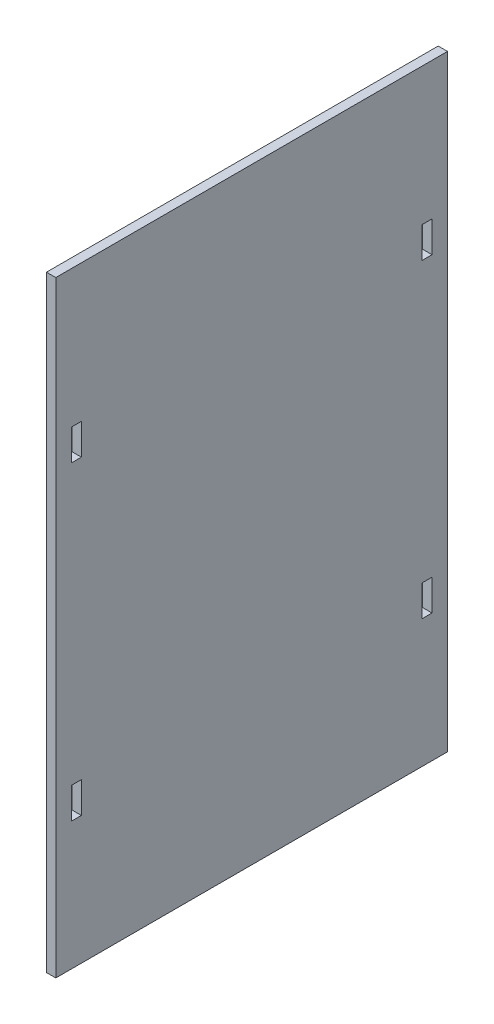
ISO-10303-21;
HEADER;
FILE_DESCRIPTION(('STEP AP214'),'2;1');
FILE_NAME('part.step','',(''),(''),'','','');
FILE_SCHEMA(('AUTOMOTIVE_DESIGN { 1 0 10303 214 1 1 1 1 }'));
ENDSEC;
DATA;
#1=APPLICATION_CONTEXT('core data for automotive mechanical design processes');
#2=APPLICATION_PROTOCOL_DEFINITION('international standard','automotive_design',2000,#1);
#3=PRODUCT_CONTEXT('',#1,'mechanical');
#4=PRODUCT('Part','Part','',(#3));
#5=PRODUCT_RELATED_PRODUCT_CATEGORY('part','',(#4));
#6=PRODUCT_DEFINITION_FORMATION('','',#4);
#7=PRODUCT_DEFINITION_CONTEXT('part definition',#1,'design');
#8=PRODUCT_DEFINITION('design','',#6,#7);
#9=PRODUCT_DEFINITION_SHAPE('','',#8);
#10=(LENGTH_UNIT() NAMED_UNIT(*) SI_UNIT(.MILLI.,.METRE.));
#11=(NAMED_UNIT(*) PLANE_ANGLE_UNIT() SI_UNIT($,.RADIAN.));
#12=(NAMED_UNIT(*) SI_UNIT($,.STERADIAN.) SOLID_ANGLE_UNIT());
#13=UNCERTAINTY_MEASURE_WITH_UNIT(LENGTH_MEASURE(1.E-05),#10,'distance_accuracy_value','');
#14=(GEOMETRIC_REPRESENTATION_CONTEXT(3) GLOBAL_UNCERTAINTY_ASSIGNED_CONTEXT((#13)) GLOBAL_UNIT_ASSIGNED_CONTEXT((#10,
#11,#12)) REPRESENTATION_CONTEXT('',''));
#15=CARTESIAN_POINT('',(0.,0.,0.));
#16=DIRECTION('',(0.,0.,1.));
#17=DIRECTION('',(1.,0.,0.));
#18=AXIS2_PLACEMENT_3D('',#15,#16,#17);
#19=CARTESIAN_POINT('',(6.,0.,0.));
#20=DIRECTION('',(1.,0.,0.));
#21=DIRECTION('',(0.,0.,-1.));
#22=AXIS2_PLACEMENT_3D('',#19,#20,#21);
#23=PLANE('',#22);
#24=DIRECTION('',(0.,-1.,0.));
#25=VECTOR('',#24,1.);
#26=CARTESIAN_POINT('',(6.,391.,0.));
#27=LINE('',#26,#25);
#28=CARTESIAN_POINT('',(6.,391.,0.));
#29=VERTEX_POINT('',#28);
#30=CARTESIAN_POINT('',(6.,0.,0.));
#31=VERTEX_POINT('',#30);
#32=EDGE_CURVE('E360',#29,#31,#27,.T.);
#33=ORIENTED_EDGE('',*,*,#32,.T.);
#34=DIRECTION('',(0.,0.,-1.));
#35=VECTOR('',#34,1.);
#36=CARTESIAN_POINT('',(6.,0.,0.));
#37=LINE('',#36,#35);
#38=CARTESIAN_POINT('',(6.,0.,-252.5));
#39=VERTEX_POINT('',#38);
#40=EDGE_CURVE('E364',#31,#39,#37,.T.);
#41=ORIENTED_EDGE('',*,*,#40,.T.);
#42=DIRECTION('',(0.,1.,0.));
#43=VECTOR('',#42,1.);
#44=CARTESIAN_POINT('',(6.,0.,-252.5));
#45=LINE('',#44,#43);
#46=CARTESIAN_POINT('',(6.,391.,-252.5));
#47=VERTEX_POINT('',#46);
#48=EDGE_CURVE('E368',#39,#47,#45,.T.);
#49=ORIENTED_EDGE('',*,*,#48,.T.);
#50=DIRECTION('',(0.,0.,1.));
#51=VECTOR('',#50,1.);
#52=CARTESIAN_POINT('',(6.,391.,-252.5));
#53=LINE('',#52,#51);
#54=EDGE_CURVE('E371',#47,#29,#53,.T.);
#55=ORIENTED_EDGE('',*,*,#54,.T.);
#56=EDGE_LOOP('',(#33,#41,#49,#55));
#57=FACE_BOUND('',#56,.T.);
#58=DIRECTION('',(0.,0.,-1.));
#59=VECTOR('',#58,1.);
#60=CARTESIAN_POINT('',(6.,282.5,-10.));
#61=LINE('',#60,#59);
#62=CARTESIAN_POINT('',(6.,282.5,-10.));
#63=VERTEX_POINT('',#62);
#64=CARTESIAN_POINT('',(6.,282.5,-16.5));
#65=VERTEX_POINT('',#64);
#66=EDGE_CURVE('E320',#63,#65,#61,.T.);
#67=ORIENTED_EDGE('',*,*,#66,.F.);
#68=DIRECTION('',(0.,-1.,0.));
#69=VECTOR('',#68,1.);
#70=CARTESIAN_POINT('',(6.,302.5,-10.));
#71=LINE('',#70,#69);
#72=CARTESIAN_POINT('',(6.,302.5,-10.));
#73=VERTEX_POINT('',#72);
#74=EDGE_CURVE('E317',#73,#63,#71,.T.);
#75=ORIENTED_EDGE('',*,*,#74,.F.);
#76=DIRECTION('',(0.,0.,1.));
#77=VECTOR('',#76,1.);
#78=CARTESIAN_POINT('',(6.,302.5,-16.5));
#79=LINE('',#78,#77);
#80=CARTESIAN_POINT('',(6.,302.5,-16.5));
#81=VERTEX_POINT('',#80);
#82=EDGE_CURVE('E328',#81,#73,#79,.T.);
#83=ORIENTED_EDGE('',*,*,#82,.F.);
#84=DIRECTION('',(0.,1.,0.));
#85=VECTOR('',#84,1.);
#86=CARTESIAN_POINT('',(6.,282.5,-16.5));
#87=LINE('',#86,#85);
#88=EDGE_CURVE('E324',#65,#81,#87,.T.);
#89=ORIENTED_EDGE('',*,*,#88,.F.);
#90=EDGE_LOOP('',(#67,#75,#83,#89));
#91=FACE_BOUND('',#90,.T.);
#92=DIRECTION('',(0.,0.,-1.));
#93=VECTOR('',#92,1.);
#94=CARTESIAN_POINT('',(6.,282.5,-236.));
#95=LINE('',#94,#93);
#96=CARTESIAN_POINT('',(6.,282.5,-236.));
#97=VERTEX_POINT('',#96);
#98=CARTESIAN_POINT('',(6.,282.5,-242.5));
#99=VERTEX_POINT('',#98);
#100=EDGE_CURVE('E277',#97,#99,#95,.T.);
#101=ORIENTED_EDGE('',*,*,#100,.F.);
#102=DIRECTION('',(0.,-1.,0.));
#103=VECTOR('',#102,1.);
#104=CARTESIAN_POINT('',(6.,302.5,-236.));
#105=LINE('',#104,#103);
#106=CARTESIAN_POINT('',(6.,302.5,-236.));
#107=VERTEX_POINT('',#106);
#108=EDGE_CURVE('E274',#107,#97,#105,.T.);
#109=ORIENTED_EDGE('',*,*,#108,.F.);
#110=DIRECTION('',(0.,0.,1.));
#111=VECTOR('',#110,1.);
#112=CARTESIAN_POINT('',(6.,302.5,-242.5));
#113=LINE('',#112,#111);
#114=CARTESIAN_POINT('',(6.,302.5,-242.5));
#115=VERTEX_POINT('',#114);
#116=EDGE_CURVE('E285',#115,#107,#113,.T.);
#117=ORIENTED_EDGE('',*,*,#116,.F.);
#118=DIRECTION('',(0.,1.,0.));
#119=VECTOR('',#118,1.);
#120=CARTESIAN_POINT('',(6.,302.5,-242.5));
#121=LINE('',#120,#119);
#122=EDGE_CURVE('E281',#99,#115,#121,.T.);
#123=ORIENTED_EDGE('',*,*,#122,.F.);
#124=EDGE_LOOP('',(#101,#109,#117,#123));
#125=FACE_BOUND('',#124,.T.);
#126=DIRECTION('',(0.,0.,-1.));
#127=VECTOR('',#126,1.);
#128=CARTESIAN_POINT('',(6.,82.5000000000001,-236.));
#129=LINE('',#128,#127);
#130=CARTESIAN_POINT('',(6.,82.5000000000001,-236.));
#131=VERTEX_POINT('',#130);
#132=CARTESIAN_POINT('',(6.,82.5000000000001,-242.5));
#133=VERTEX_POINT('',#132);
#134=EDGE_CURVE('E234',#131,#133,#129,.T.);
#135=ORIENTED_EDGE('',*,*,#134,.F.);
#136=DIRECTION('',(0.,-1.,0.));
#137=VECTOR('',#136,1.);
#138=CARTESIAN_POINT('',(6.,102.5,-236.));
#139=LINE('',#138,#137);
#140=CARTESIAN_POINT('',(6.,102.5,-236.));
#141=VERTEX_POINT('',#140);
#142=EDGE_CURVE('E231',#141,#131,#139,.T.);
#143=ORIENTED_EDGE('',*,*,#142,.F.);
#144=DIRECTION('',(0.,0.,1.));
#145=VECTOR('',#144,1.);
#146=CARTESIAN_POINT('',(6.,102.5,-242.5));
#147=LINE('',#146,#145);
#148=CARTESIAN_POINT('',(6.,102.5,-242.5));
#149=VERTEX_POINT('',#148);
#150=EDGE_CURVE('E242',#149,#141,#147,.T.);
#151=ORIENTED_EDGE('',*,*,#150,.F.);
#152=DIRECTION('',(0.,1.,0.));
#153=VECTOR('',#152,1.);
#154=CARTESIAN_POINT('',(6.,102.5,-242.5));
#155=LINE('',#154,#153);
#156=EDGE_CURVE('E238',#133,#149,#155,.T.);
#157=ORIENTED_EDGE('',*,*,#156,.F.);
#158=EDGE_LOOP('',(#135,#143,#151,#157));
#159=FACE_BOUND('',#158,.T.);
#160=DIRECTION('',(0.,0.,-1.));
#161=VECTOR('',#160,1.);
#162=CARTESIAN_POINT('',(6.,82.5000000000001,-10.));
#163=LINE('',#162,#161);
#164=CARTESIAN_POINT('',(6.,82.5000000000001,-10.));
#165=VERTEX_POINT('',#164);
#166=CARTESIAN_POINT('',(6.,82.5000000000001,-16.5));
#167=VERTEX_POINT('',#166);
#168=EDGE_CURVE('E192',#165,#167,#163,.T.);
#169=ORIENTED_EDGE('',*,*,#168,.F.);
#170=DIRECTION('',(0.,-1.,0.));
#171=VECTOR('',#170,1.);
#172=CARTESIAN_POINT('',(6.,102.5,-10.));
#173=LINE('',#172,#171);
#174=CARTESIAN_POINT('',(6.,102.5,-10.));
#175=VERTEX_POINT('',#174);
#176=EDGE_CURVE('E183',#175,#165,#173,.T.);
#177=ORIENTED_EDGE('',*,*,#176,.F.);
#178=DIRECTION('',(0.,0.,1.));
#179=VECTOR('',#178,1.);
#180=CARTESIAN_POINT('',(6.,102.5,-16.5));
#181=LINE('',#180,#179);
#182=CARTESIAN_POINT('',(6.,102.5,-16.5));
#183=VERTEX_POINT('',#182);
#184=EDGE_CURVE('E209',#183,#175,#181,.T.);
#185=ORIENTED_EDGE('',*,*,#184,.F.);
#186=DIRECTION('',(0.,1.,0.));
#187=VECTOR('',#186,1.);
#188=CARTESIAN_POINT('',(6.,82.5000000000001,-16.5));
#189=LINE('',#188,#187);
#190=EDGE_CURVE('E205',#167,#183,#189,.T.);
#191=ORIENTED_EDGE('',*,*,#190,.F.);
#192=EDGE_LOOP('',(#169,#177,#185,#191));
#193=FACE_BOUND('',#192,.T.);
#194=ADVANCED_FACE('F45',(#57,#91,#125,#159,#193),#23,.T.);
#195=CARTESIAN_POINT('',(0.,0.,0.));
#196=DIRECTION('',(1.,0.,0.));
#197=DIRECTION('',(0.,0.,-1.));
#198=AXIS2_PLACEMENT_3D('',#195,#196,#197);
#199=PLANE('',#198);
#200=DIRECTION('',(0.,-1.,0.));
#201=VECTOR('',#200,1.);
#202=CARTESIAN_POINT('',(0.,102.5,-236.));
#203=LINE('',#202,#201);
#204=CARTESIAN_POINT('',(0.,102.5,-236.));
#205=VERTEX_POINT('',#204);
#206=CARTESIAN_POINT('',(0.,82.5000000000001,-236.));
#207=VERTEX_POINT('',#206);
#208=EDGE_CURVE('E201',#205,#207,#203,.T.);
#209=ORIENTED_EDGE('',*,*,#208,.T.);
#210=DIRECTION('',(0.,0.,-1.));
#211=VECTOR('',#210,1.);
#212=CARTESIAN_POINT('',(0.,82.5000000000001,-236.));
#213=LINE('',#212,#211);
#214=CARTESIAN_POINT('',(0.,82.5000000000001,-242.5));
#215=VERTEX_POINT('',#214);
#216=EDGE_CURVE('E249',#207,#215,#213,.T.);
#217=ORIENTED_EDGE('',*,*,#216,.T.);
#218=DIRECTION('',(0.,1.,0.));
#219=VECTOR('',#218,1.);
#220=CARTESIAN_POINT('',(0.,102.5,-242.5));
#221=LINE('',#220,#219);
#222=CARTESIAN_POINT('',(0.,102.5,-242.5));
#223=VERTEX_POINT('',#222);
#224=EDGE_CURVE('E253',#215,#223,#221,.T.);
#225=ORIENTED_EDGE('',*,*,#224,.T.);
#226=DIRECTION('',(0.,0.,1.));
#227=VECTOR('',#226,1.);
#228=CARTESIAN_POINT('',(0.,102.5,-242.5));
#229=LINE('',#228,#227);
#230=EDGE_CURVE('E235',#223,#205,#229,.T.);
#231=ORIENTED_EDGE('',*,*,#230,.T.);
#232=EDGE_LOOP('',(#209,#217,#225,#231));
#233=FACE_BOUND('',#232,.T.);
#234=DIRECTION('',(0.,-1.,0.));
#235=VECTOR('',#234,1.);
#236=CARTESIAN_POINT('',(0.,302.5,-10.));
#237=LINE('',#236,#235);
#238=CARTESIAN_POINT('',(0.,302.5,-10.));
#239=VERTEX_POINT('',#238);
#240=CARTESIAN_POINT('',(0.,282.5,-10.));
#241=VERTEX_POINT('',#240);
#242=EDGE_CURVE('E316',#239,#241,#237,.T.);
#243=ORIENTED_EDGE('',*,*,#242,.T.);
#244=DIRECTION('',(0.,0.,-1.));
#245=VECTOR('',#244,1.);
#246=CARTESIAN_POINT('',(0.,282.5,-10.));
#247=LINE('',#246,#245);
#248=CARTESIAN_POINT('',(0.,282.5,-16.5));
#249=VERTEX_POINT('',#248);
#250=EDGE_CURVE('E335',#241,#249,#247,.T.);
#251=ORIENTED_EDGE('',*,*,#250,.T.);
#252=DIRECTION('',(0.,1.,0.));
#253=VECTOR('',#252,1.);
#254=CARTESIAN_POINT('',(0.,282.5,-16.5));
#255=LINE('',#254,#253);
#256=CARTESIAN_POINT('',(0.,302.5,-16.5));
#257=VERTEX_POINT('',#256);
#258=EDGE_CURVE('E339',#249,#257,#255,.T.);
#259=ORIENTED_EDGE('',*,*,#258,.T.);
#260=DIRECTION('',(0.,0.,1.));
#261=VECTOR('',#260,1.);
#262=CARTESIAN_POINT('',(0.,302.5,-16.5));
#263=LINE('',#262,#261);
#264=EDGE_CURVE('E321',#257,#239,#263,.T.);
#265=ORIENTED_EDGE('',*,*,#264,.T.);
#266=EDGE_LOOP('',(#243,#251,#259,#265));
#267=FACE_BOUND('',#266,.T.);
#268=DIRECTION('',(0.,-1.,0.));
#269=VECTOR('',#268,1.);
#270=CARTESIAN_POINT('',(0.,391.,0.));
#271=LINE('',#270,#269);
#272=CARTESIAN_POINT('',(0.,391.,0.));
#273=VERTEX_POINT('',#272);
#274=CARTESIAN_POINT('',(0.,0.,0.));
#275=VERTEX_POINT('',#274);
#276=EDGE_CURVE('E359',#273,#275,#271,.T.);
#277=ORIENTED_EDGE('',*,*,#276,.F.);
#278=DIRECTION('',(0.,0.,1.));
#279=VECTOR('',#278,1.);
#280=CARTESIAN_POINT('',(0.,391.,-252.5));
#281=LINE('',#280,#279);
#282=CARTESIAN_POINT('',(0.,391.,-252.5));
#283=VERTEX_POINT('',#282);
#284=EDGE_CURVE('E365',#283,#273,#281,.T.);
#285=ORIENTED_EDGE('',*,*,#284,.F.);
#286=DIRECTION('',(0.,1.,0.));
#287=VECTOR('',#286,1.);
#288=CARTESIAN_POINT('',(0.,0.,-252.5));
#289=LINE('',#288,#287);
#290=CARTESIAN_POINT('',(0.,0.,-252.5));
#291=VERTEX_POINT('',#290);
#292=EDGE_CURVE('E381',#291,#283,#289,.T.);
#293=ORIENTED_EDGE('',*,*,#292,.F.);
#294=DIRECTION('',(0.,0.,-1.));
#295=VECTOR('',#294,1.);
#296=CARTESIAN_POINT('',(0.,0.,0.));
#297=LINE('',#296,#295);
#298=EDGE_CURVE('E378',#275,#291,#297,.T.);
#299=ORIENTED_EDGE('',*,*,#298,.F.);
#300=EDGE_LOOP('',(#277,#285,#293,#299));
#301=FACE_BOUND('',#300,.T.);
#302=DIRECTION('',(0.,-1.,0.));
#303=VECTOR('',#302,1.);
#304=CARTESIAN_POINT('',(0.,302.5,-236.));
#305=LINE('',#304,#303);
#306=CARTESIAN_POINT('',(0.,302.5,-236.));
#307=VERTEX_POINT('',#306);
#308=CARTESIAN_POINT('',(0.,282.5,-236.));
#309=VERTEX_POINT('',#308);
#310=EDGE_CURVE('E273',#307,#309,#305,.T.);
#311=ORIENTED_EDGE('',*,*,#310,.T.);
#312=DIRECTION('',(0.,0.,-1.));
#313=VECTOR('',#312,1.);
#314=CARTESIAN_POINT('',(0.,282.5,-236.));
#315=LINE('',#314,#313);
#316=CARTESIAN_POINT('',(0.,282.5,-242.5));
#317=VERTEX_POINT('',#316);
#318=EDGE_CURVE('E292',#309,#317,#315,.T.);
#319=ORIENTED_EDGE('',*,*,#318,.T.);
#320=DIRECTION('',(0.,1.,0.));
#321=VECTOR('',#320,1.);
#322=CARTESIAN_POINT('',(0.,302.5,-242.5));
#323=LINE('',#322,#321);
#324=CARTESIAN_POINT('',(0.,302.5,-242.5));
#325=VERTEX_POINT('',#324);
#326=EDGE_CURVE('E296',#317,#325,#323,.T.);
#327=ORIENTED_EDGE('',*,*,#326,.T.);
#328=DIRECTION('',(0.,0.,1.));
#329=VECTOR('',#328,1.);
#330=CARTESIAN_POINT('',(0.,302.5,-242.5));
#331=LINE('',#330,#329);
#332=EDGE_CURVE('E278',#325,#307,#331,.T.);
#333=ORIENTED_EDGE('',*,*,#332,.T.);
#334=EDGE_LOOP('',(#311,#319,#327,#333));
#335=FACE_BOUND('',#334,.T.);
#336=DIRECTION('',(0.,-1.,0.));
#337=VECTOR('',#336,1.);
#338=CARTESIAN_POINT('',(0.,102.5,-10.));
#339=LINE('',#338,#337);
#340=CARTESIAN_POINT('',(0.,102.5,-10.));
#341=VERTEX_POINT('',#340);
#342=CARTESIAN_POINT('',(0.,82.5000000000001,-10.));
#343=VERTEX_POINT('',#342);
#344=EDGE_CURVE('E69',#341,#343,#339,.T.);
#345=ORIENTED_EDGE('',*,*,#344,.T.);
#346=DIRECTION('',(0.,0.,-1.));
#347=VECTOR('',#346,1.);
#348=CARTESIAN_POINT('',(0.,82.5000000000001,-10.));
#349=LINE('',#348,#347);
#350=CARTESIAN_POINT('',(0.,82.5000000000001,-16.5));
#351=VERTEX_POINT('',#350);
#352=EDGE_CURVE('E199',#343,#351,#349,.T.);
#353=ORIENTED_EDGE('',*,*,#352,.T.);
#354=DIRECTION('',(0.,1.,0.));
#355=VECTOR('',#354,1.);
#356=CARTESIAN_POINT('',(0.,82.5000000000001,-16.5));
#357=LINE('',#356,#355);
#358=CARTESIAN_POINT('',(0.,102.5,-16.5));
#359=VERTEX_POINT('',#358);
#360=EDGE_CURVE('E218',#351,#359,#357,.T.);
#361=ORIENTED_EDGE('',*,*,#360,.T.);
#362=DIRECTION('',(0.,0.,1.));
#363=VECTOR('',#362,1.);
#364=CARTESIAN_POINT('',(0.,102.5,-16.5));
#365=LINE('',#364,#363);
#366=EDGE_CURVE('E193',#359,#341,#365,.T.);
#367=ORIENTED_EDGE('',*,*,#366,.T.);
#368=EDGE_LOOP('',(#345,#353,#361,#367));
#369=FACE_BOUND('',#368,.T.);
#370=ADVANCED_FACE('F404',(#233,#267,#301,#335,#369),#199,.F.);
#371=CARTESIAN_POINT('',(6.,391.,0.));
#372=DIRECTION('',(0.,0.,-1.));
#373=DIRECTION('',(0.,1.,0.));
#374=AXIS2_PLACEMENT_3D('',#371,#372,#373);
#375=PLANE('',#374);
#376=ORIENTED_EDGE('',*,*,#276,.T.);
#377=DIRECTION('',(-1.,0.,0.));
#378=VECTOR('',#377,1.);
#379=CARTESIAN_POINT('',(6.,0.,0.));
#380=LINE('',#379,#378);
#381=EDGE_CURVE('E11',#31,#275,#380,.T.);
#382=ORIENTED_EDGE('',*,*,#381,.F.);
#383=ORIENTED_EDGE('',*,*,#32,.F.);
#384=DIRECTION('',(-1.,0.,0.));
#385=VECTOR('',#384,1.);
#386=CARTESIAN_POINT('',(6.,391.,0.));
#387=LINE('',#386,#385);
#388=EDGE_CURVE('E374',#29,#273,#387,.T.);
#389=ORIENTED_EDGE('',*,*,#388,.T.);
#390=EDGE_LOOP('',(#376,#382,#383,#389));
#391=FACE_BOUND('',#390,.T.);
#392=ADVANCED_FACE('F47',(#391),#375,.F.);
#393=CARTESIAN_POINT('',(6.,0.,0.));
#394=DIRECTION('',(0.,1.,0.));
#395=DIRECTION('',(0.,0.,1.));
#396=AXIS2_PLACEMENT_3D('',#393,#394,#395);
#397=PLANE('',#396);
#398=ORIENTED_EDGE('',*,*,#298,.T.);
#399=DIRECTION('',(-1.,0.,0.));
#400=VECTOR('',#399,1.);
#401=CARTESIAN_POINT('',(6.,0.,-252.5));
#402=LINE('',#401,#400);
#403=EDGE_CURVE('E54',#39,#291,#402,.T.);
#404=ORIENTED_EDGE('',*,*,#403,.F.);
#405=ORIENTED_EDGE('',*,*,#40,.F.);
#406=ORIENTED_EDGE('',*,*,#381,.T.);
#407=EDGE_LOOP('',(#398,#404,#405,#406));
#408=FACE_BOUND('',#407,.T.);
#409=ADVANCED_FACE('F415',(#408),#397,.F.);
#410=CARTESIAN_POINT('',(6.,0.,-252.5));
#411=DIRECTION('',(0.,0.,1.));
#412=DIRECTION('',(1.,0.,0.));
#413=AXIS2_PLACEMENT_3D('',#410,#411,#412);
#414=PLANE('',#413);
#415=ORIENTED_EDGE('',*,*,#292,.T.);
#416=DIRECTION('',(-1.,0.,0.));
#417=VECTOR('',#416,1.);
#418=CARTESIAN_POINT('',(6.,391.,-252.5));
#419=LINE('',#418,#417);
#420=EDGE_CURVE('E389',#47,#283,#419,.T.);
#421=ORIENTED_EDGE('',*,*,#420,.F.);
#422=ORIENTED_EDGE('',*,*,#48,.F.);
#423=ORIENTED_EDGE('',*,*,#403,.T.);
#424=EDGE_LOOP('',(#415,#421,#422,#423));
#425=FACE_BOUND('',#424,.T.);
#426=ADVANCED_FACE('F398',(#425),#414,.F.);
#427=CARTESIAN_POINT('',(6.,391.,-252.5));
#428=DIRECTION('',(0.,-1.,0.));
#429=DIRECTION('',(0.,0.,-1.));
#430=AXIS2_PLACEMENT_3D('',#427,#428,#429);
#431=PLANE('',#430);
#432=ORIENTED_EDGE('',*,*,#284,.T.);
#433=ORIENTED_EDGE('',*,*,#388,.F.);
#434=ORIENTED_EDGE('',*,*,#54,.F.);
#435=ORIENTED_EDGE('',*,*,#420,.T.);
#436=EDGE_LOOP('',(#432,#433,#434,#435));
#437=FACE_BOUND('',#436,.T.);
#438=ADVANCED_FACE('F408',(#437),#431,.F.);
#439=CARTESIAN_POINT('',(6.,302.5,-10.));
#440=DIRECTION('',(0.,0.,-1.));
#441=DIRECTION('',(0.,1.,0.));
#442=AXIS2_PLACEMENT_3D('',#439,#440,#441);
#443=PLANE('',#442);
#444=ORIENTED_EDGE('',*,*,#242,.F.);
#445=DIRECTION('',(-1.,0.,0.));
#446=VECTOR('',#445,1.);
#447=CARTESIAN_POINT('',(6.,302.5,-10.));
#448=LINE('',#447,#446);
#449=EDGE_CURVE('E331',#73,#239,#448,.T.);
#450=ORIENTED_EDGE('',*,*,#449,.F.);
#451=ORIENTED_EDGE('',*,*,#74,.T.);
#452=DIRECTION('',(-1.,0.,0.));
#453=VECTOR('',#452,1.);
#454=CARTESIAN_POINT('',(6.,282.5,-10.));
#455=LINE('',#454,#453);
#456=EDGE_CURVE('E355',#63,#241,#455,.T.);
#457=ORIENTED_EDGE('',*,*,#456,.T.);
#458=EDGE_LOOP('',(#444,#450,#451,#457));
#459=FACE_BOUND('',#458,.T.);
#460=ADVANCED_FACE('F430',(#459),#443,.T.);
#461=CARTESIAN_POINT('',(6.,282.5,-10.));
#462=DIRECTION('',(0.,1.,0.));
#463=DIRECTION('',(0.,0.,1.));
#464=AXIS2_PLACEMENT_3D('',#461,#462,#463);
#465=PLANE('',#464);
#466=ORIENTED_EDGE('',*,*,#250,.F.);
#467=ORIENTED_EDGE('',*,*,#456,.F.);
#468=ORIENTED_EDGE('',*,*,#66,.T.);
#469=DIRECTION('',(-1.,0.,0.));
#470=VECTOR('',#469,1.);
#471=CARTESIAN_POINT('',(6.,282.5,-16.5));
#472=LINE('',#471,#470);
#473=EDGE_CURVE('E352',#65,#249,#472,.T.);
#474=ORIENTED_EDGE('',*,*,#473,.T.);
#475=EDGE_LOOP('',(#466,#467,#468,#474));
#476=FACE_BOUND('',#475,.T.);
#477=ADVANCED_FACE('F437',(#476),#465,.T.);
#478=CARTESIAN_POINT('',(6.,282.5,-16.5));
#479=DIRECTION('',(0.,0.,1.));
#480=DIRECTION('',(0.,-1.,0.));
#481=AXIS2_PLACEMENT_3D('',#478,#479,#480);
#482=PLANE('',#481);
#483=ORIENTED_EDGE('',*,*,#258,.F.);
#484=ORIENTED_EDGE('',*,*,#473,.F.);
#485=ORIENTED_EDGE('',*,*,#88,.T.);
#486=DIRECTION('',(-1.,0.,0.));
#487=VECTOR('',#486,1.);
#488=CARTESIAN_POINT('',(6.,302.5,-16.5));
#489=LINE('',#488,#487);
#490=EDGE_CURVE('E349',#81,#257,#489,.T.);
#491=ORIENTED_EDGE('',*,*,#490,.T.);
#492=EDGE_LOOP('',(#483,#484,#485,#491));
#493=FACE_BOUND('',#492,.T.);
#494=ADVANCED_FACE('F442',(#493),#482,.T.);
#495=CARTESIAN_POINT('',(6.,302.5,-16.5));
#496=DIRECTION('',(0.,-1.,0.));
#497=DIRECTION('',(0.,0.,-1.));
#498=AXIS2_PLACEMENT_3D('',#495,#496,#497);
#499=PLANE('',#498);
#500=ORIENTED_EDGE('',*,*,#264,.F.);
#501=ORIENTED_EDGE('',*,*,#490,.F.);
#502=ORIENTED_EDGE('',*,*,#82,.T.);
#503=ORIENTED_EDGE('',*,*,#449,.T.);
#504=EDGE_LOOP('',(#500,#501,#502,#503));
#505=FACE_BOUND('',#504,.T.);
#506=ADVANCED_FACE('F450',(#505),#499,.T.);
#507=CARTESIAN_POINT('',(6.,302.5,-236.));
#508=DIRECTION('',(0.,0.,-1.));
#509=DIRECTION('',(-1.,0.,0.));
#510=AXIS2_PLACEMENT_3D('',#507,#508,#509);
#511=PLANE('',#510);
#512=ORIENTED_EDGE('',*,*,#310,.F.);
#513=DIRECTION('',(-1.,0.,0.));
#514=VECTOR('',#513,1.);
#515=CARTESIAN_POINT('',(6.,302.5,-236.));
#516=LINE('',#515,#514);
#517=EDGE_CURVE('E288',#107,#307,#516,.T.);
#518=ORIENTED_EDGE('',*,*,#517,.F.);
#519=ORIENTED_EDGE('',*,*,#108,.T.);
#520=DIRECTION('',(-1.,0.,0.));
#521=VECTOR('',#520,1.);
#522=CARTESIAN_POINT('',(6.,282.5,-236.));
#523=LINE('',#522,#521);
#524=EDGE_CURVE('E312',#97,#309,#523,.T.);
#525=ORIENTED_EDGE('',*,*,#524,.T.);
#526=EDGE_LOOP('',(#512,#518,#519,#525));
#527=FACE_BOUND('',#526,.T.);
#528=ADVANCED_FACE('F504',(#527),#511,.T.);
#529=CARTESIAN_POINT('',(6.,282.5,-236.));
#530=DIRECTION('',(0.,1.,0.));
#531=DIRECTION('',(0.,0.,1.));
#532=AXIS2_PLACEMENT_3D('',#529,#530,#531);
#533=PLANE('',#532);
#534=ORIENTED_EDGE('',*,*,#318,.F.);
#535=ORIENTED_EDGE('',*,*,#524,.F.);
#536=ORIENTED_EDGE('',*,*,#100,.T.);
#537=DIRECTION('',(-1.,0.,0.));
#538=VECTOR('',#537,1.);
#539=CARTESIAN_POINT('',(6.,282.5,-242.5));
#540=LINE('',#539,#538);
#541=EDGE_CURVE('E309',#99,#317,#540,.T.);
#542=ORIENTED_EDGE('',*,*,#541,.T.);
#543=EDGE_LOOP('',(#534,#535,#536,#542));
#544=FACE_BOUND('',#543,.T.);
#545=ADVANCED_FACE('F500',(#544),#533,.T.);
#546=CARTESIAN_POINT('',(6.,302.5,-242.5));
#547=DIRECTION('',(0.,0.,1.));
#548=DIRECTION('',(1.,0.,0.));
#549=AXIS2_PLACEMENT_3D('',#546,#547,#548);
#550=PLANE('',#549);
#551=ORIENTED_EDGE('',*,*,#326,.F.);
#552=ORIENTED_EDGE('',*,*,#541,.F.);
#553=ORIENTED_EDGE('',*,*,#122,.T.);
#554=DIRECTION('',(-1.,0.,0.));
#555=VECTOR('',#554,1.);
#556=CARTESIAN_POINT('',(6.,302.5,-242.5));
#557=LINE('',#556,#555);
#558=EDGE_CURVE('E306',#115,#325,#557,.T.);
#559=ORIENTED_EDGE('',*,*,#558,.T.);
#560=EDGE_LOOP('',(#551,#552,#553,#559));
#561=FACE_BOUND('',#560,.T.);
#562=ADVANCED_FACE('F496',(#561),#550,.T.);
#563=CARTESIAN_POINT('',(6.,302.5,-242.5));
#564=DIRECTION('',(0.,-1.,0.));
#565=DIRECTION('',(0.,0.,-1.));
#566=AXIS2_PLACEMENT_3D('',#563,#564,#565);
#567=PLANE('',#566);
#568=ORIENTED_EDGE('',*,*,#332,.F.);
#569=ORIENTED_EDGE('',*,*,#558,.F.);
#570=ORIENTED_EDGE('',*,*,#116,.T.);
#571=ORIENTED_EDGE('',*,*,#517,.T.);
#572=EDGE_LOOP('',(#568,#569,#570,#571));
#573=FACE_BOUND('',#572,.T.);
#574=ADVANCED_FACE('F493',(#573),#567,.T.);
#575=CARTESIAN_POINT('',(6.,102.5,-236.));
#576=DIRECTION('',(0.,0.,-1.));
#577=DIRECTION('',(-1.,0.,0.));
#578=AXIS2_PLACEMENT_3D('',#575,#576,#577);
#579=PLANE('',#578);
#580=ORIENTED_EDGE('',*,*,#208,.F.);
#581=DIRECTION('',(-1.,0.,0.));
#582=VECTOR('',#581,1.);
#583=CARTESIAN_POINT('',(6.,102.5,-236.));
#584=LINE('',#583,#582);
#585=EDGE_CURVE('E245',#141,#205,#584,.T.);
#586=ORIENTED_EDGE('',*,*,#585,.F.);
#587=ORIENTED_EDGE('',*,*,#142,.T.);
#588=DIRECTION('',(-1.,0.,0.));
#589=VECTOR('',#588,1.);
#590=CARTESIAN_POINT('',(6.,82.5000000000001,-236.));
#591=LINE('',#590,#589);
#592=EDGE_CURVE('E269',#131,#207,#591,.T.);
#593=ORIENTED_EDGE('',*,*,#592,.T.);
#594=EDGE_LOOP('',(#580,#586,#587,#593));
#595=FACE_BOUND('',#594,.T.);
#596=ADVANCED_FACE('F475',(#595),#579,.T.);
#597=CARTESIAN_POINT('',(6.,82.5000000000001,-236.));
#598=DIRECTION('',(0.,1.,0.));
#599=DIRECTION('',(0.,0.,1.));
#600=AXIS2_PLACEMENT_3D('',#597,#598,#599);
#601=PLANE('',#600);
#602=ORIENTED_EDGE('',*,*,#216,.F.);
#603=ORIENTED_EDGE('',*,*,#592,.F.);
#604=ORIENTED_EDGE('',*,*,#134,.T.);
#605=DIRECTION('',(-1.,0.,0.));
#606=VECTOR('',#605,1.);
#607=CARTESIAN_POINT('',(6.,82.5000000000001,-242.5));
#608=LINE('',#607,#606);
#609=EDGE_CURVE('E266',#133,#215,#608,.T.);
#610=ORIENTED_EDGE('',*,*,#609,.T.);
#611=EDGE_LOOP('',(#602,#603,#604,#610));
#612=FACE_BOUND('',#611,.T.);
#613=ADVANCED_FACE('F469',(#612),#601,.T.);
#614=CARTESIAN_POINT('',(6.,102.5,-242.5));
#615=DIRECTION('',(0.,0.,1.));
#616=DIRECTION('',(1.,0.,0.));
#617=AXIS2_PLACEMENT_3D('',#614,#615,#616);
#618=PLANE('',#617);
#619=ORIENTED_EDGE('',*,*,#224,.F.);
#620=ORIENTED_EDGE('',*,*,#609,.F.);
#621=ORIENTED_EDGE('',*,*,#156,.T.);
#622=DIRECTION('',(-1.,0.,0.));
#623=VECTOR('',#622,1.);
#624=CARTESIAN_POINT('',(6.,102.5,-242.5));
#625=LINE('',#624,#623);
#626=EDGE_CURVE('E263',#149,#223,#625,.T.);
#627=ORIENTED_EDGE('',*,*,#626,.T.);
#628=EDGE_LOOP('',(#619,#620,#621,#627));
#629=FACE_BOUND('',#628,.T.);
#630=ADVANCED_FACE('F472',(#629),#618,.T.);
#631=CARTESIAN_POINT('',(6.,102.5,-242.5));
#632=DIRECTION('',(0.,-1.,0.));
#633=DIRECTION('',(0.,0.,-1.));
#634=AXIS2_PLACEMENT_3D('',#631,#632,#633);
#635=PLANE('',#634);
#636=ORIENTED_EDGE('',*,*,#230,.F.);
#637=ORIENTED_EDGE('',*,*,#626,.F.);
#638=ORIENTED_EDGE('',*,*,#150,.T.);
#639=ORIENTED_EDGE('',*,*,#585,.T.);
#640=EDGE_LOOP('',(#636,#637,#638,#639));
#641=FACE_BOUND('',#640,.T.);
#642=ADVANCED_FACE('F478',(#641),#635,.T.);
#643=CARTESIAN_POINT('',(6.,102.5,-10.));
#644=DIRECTION('',(0.,0.,-1.));
#645=DIRECTION('',(0.,1.,0.));
#646=AXIS2_PLACEMENT_3D('',#643,#644,#645);
#647=PLANE('',#646);
#648=ORIENTED_EDGE('',*,*,#344,.F.);
#649=DIRECTION('',(-1.,0.,0.));
#650=VECTOR('',#649,1.);
#651=CARTESIAN_POINT('',(6.,102.5,-10.));
#652=LINE('',#651,#650);
#653=EDGE_CURVE('E187',#175,#341,#652,.T.);
#654=ORIENTED_EDGE('',*,*,#653,.F.);
#655=ORIENTED_EDGE('',*,*,#176,.T.);
#656=DIRECTION('',(-1.,0.,0.));
#657=VECTOR('',#656,1.);
#658=CARTESIAN_POINT('',(6.,82.5000000000001,-10.));
#659=LINE('',#658,#657);
#660=EDGE_CURVE('E186',#165,#343,#659,.T.);
#661=ORIENTED_EDGE('',*,*,#660,.T.);
#662=EDGE_LOOP('',(#648,#654,#655,#661));
#663=FACE_BOUND('',#662,.T.);
#664=ADVANCED_FACE('F185',(#663),#647,.T.);
#665=CARTESIAN_POINT('',(6.,82.5000000000001,-10.));
#666=DIRECTION('',(0.,1.,0.));
#667=DIRECTION('',(0.,0.,1.));
#668=AXIS2_PLACEMENT_3D('',#665,#666,#667);
#669=PLANE('',#668);
#670=ORIENTED_EDGE('',*,*,#352,.F.);
#671=ORIENTED_EDGE('',*,*,#660,.F.);
#672=ORIENTED_EDGE('',*,*,#168,.T.);
#673=DIRECTION('',(-1.,0.,0.));
#674=VECTOR('',#673,1.);
#675=CARTESIAN_POINT('',(6.,82.5000000000001,-16.5));
#676=LINE('',#675,#674);
#677=EDGE_CURVE('E202',#167,#351,#676,.T.);
#678=ORIENTED_EDGE('',*,*,#677,.T.);
#679=EDGE_LOOP('',(#670,#671,#672,#678));
#680=FACE_BOUND('',#679,.T.);
#681=ADVANCED_FACE('F196',(#680),#669,.T.);
#682=CARTESIAN_POINT('',(6.,82.5000000000001,-16.5));
#683=DIRECTION('',(0.,0.,1.));
#684=DIRECTION('',(0.,-1.,0.));
#685=AXIS2_PLACEMENT_3D('',#682,#683,#684);
#686=PLANE('',#685);
#687=ORIENTED_EDGE('',*,*,#360,.F.);
#688=ORIENTED_EDGE('',*,*,#677,.F.);
#689=ORIENTED_EDGE('',*,*,#190,.T.);
#690=DIRECTION('',(-1.,0.,0.));
#691=VECTOR('',#690,1.);
#692=CARTESIAN_POINT('',(6.,102.5,-16.5));
#693=LINE('',#692,#691);
#694=EDGE_CURVE('E61',#183,#359,#693,.T.);
#695=ORIENTED_EDGE('',*,*,#694,.T.);
#696=EDGE_LOOP('',(#687,#688,#689,#695));
#697=FACE_BOUND('',#696,.T.);
#698=ADVANCED_FACE('F576',(#697),#686,.T.);
#699=CARTESIAN_POINT('',(6.,102.5,-16.5));
#700=DIRECTION('',(0.,-1.,0.));
#701=DIRECTION('',(0.,0.,-1.));
#702=AXIS2_PLACEMENT_3D('',#699,#700,#701);
#703=PLANE('',#702);
#704=ORIENTED_EDGE('',*,*,#366,.F.);
#705=ORIENTED_EDGE('',*,*,#694,.F.);
#706=ORIENTED_EDGE('',*,*,#184,.T.);
#707=ORIENTED_EDGE('',*,*,#653,.T.);
#708=EDGE_LOOP('',(#704,#705,#706,#707));
#709=FACE_BOUND('',#708,.T.);
#710=ADVANCED_FACE('F584',(#709),#703,.T.);
#711=CLOSED_SHELL('',(#194,#370,#392,#409,#426,#438,#460,#477,#494,#506,#528,#545,#562,#574,
#596,#613,#630,#642,#664,#681,#698,#710));
#712=MANIFOLD_SOLID_BREP('B2',#711);
#713=ADVANCED_BREP_SHAPE_REPRESENTATION('',(#18,#712),#14);
#714=SHAPE_DEFINITION_REPRESENTATION(#9,#713);
ENDSEC;
END-ISO-10303-21;
